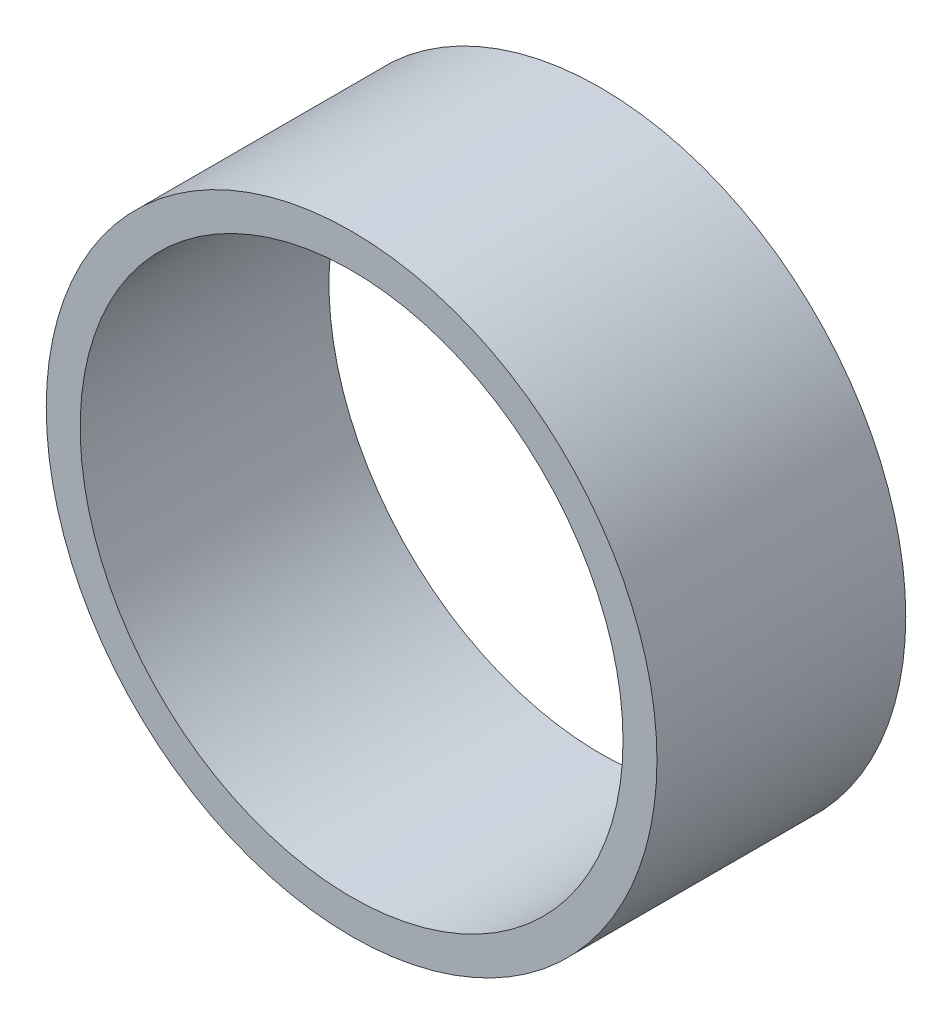
ISO-10303-21;
HEADER;
FILE_DESCRIPTION(('STEP AP214'),'2;1');
FILE_NAME('part.step','',(''),(''),'','','');
FILE_SCHEMA(('AUTOMOTIVE_DESIGN { 1 0 10303 214 1 1 1 1 }'));
ENDSEC;
DATA;
#1=APPLICATION_CONTEXT('core data for automotive mechanical design processes');
#2=APPLICATION_PROTOCOL_DEFINITION('international standard','automotive_design',2000,#1);
#3=PRODUCT_CONTEXT('',#1,'mechanical');
#4=PRODUCT('Part','Part','',(#3));
#5=PRODUCT_RELATED_PRODUCT_CATEGORY('part','',(#4));
#6=PRODUCT_DEFINITION_FORMATION('','',#4);
#7=PRODUCT_DEFINITION_CONTEXT('part definition',#1,'design');
#8=PRODUCT_DEFINITION('design','',#6,#7);
#9=PRODUCT_DEFINITION_SHAPE('','',#8);
#10=(LENGTH_UNIT() NAMED_UNIT(*) SI_UNIT(.MILLI.,.METRE.));
#11=(NAMED_UNIT(*) PLANE_ANGLE_UNIT() SI_UNIT($,.RADIAN.));
#12=(NAMED_UNIT(*) SI_UNIT($,.STERADIAN.) SOLID_ANGLE_UNIT());
#13=UNCERTAINTY_MEASURE_WITH_UNIT(LENGTH_MEASURE(1.E-05),#10,'distance_accuracy_value','');
#14=(GEOMETRIC_REPRESENTATION_CONTEXT(3) GLOBAL_UNCERTAINTY_ASSIGNED_CONTEXT((#13)) GLOBAL_UNIT_ASSIGNED_CONTEXT((#10,
#11,#12)) REPRESENTATION_CONTEXT('',''));
#15=CARTESIAN_POINT('',(0.,0.,0.));
#16=DIRECTION('',(0.,0.,1.));
#17=DIRECTION('',(1.,0.,0.));
#18=AXIS2_PLACEMENT_3D('',#15,#16,#17);
#19=CARTESIAN_POINT('',(0.,0.,27.5));
#20=DIRECTION('',(0.,0.,-1.));
#21=DIRECTION('',(-1.,0.,0.));
#22=AXIS2_PLACEMENT_3D('',#19,#20,#21);
#23=CYLINDRICAL_SURFACE('',#22,67.5);
#24=CARTESIAN_POINT('',(0.,0.,27.5));
#25=DIRECTION('',(0.,0.,1.));
#26=DIRECTION('',(1.,0.,0.));
#27=AXIS2_PLACEMENT_3D('',#24,#25,#26);
#28=CIRCLE('',#27,67.5);
#29=CARTESIAN_POINT('',(67.5,0.,27.5));
#30=VERTEX_POINT('',#29);
#31=EDGE_CURVE('E10',#30,#30,#28,.T.);
#32=ORIENTED_EDGE('',*,*,#31,.F.);
#33=EDGE_LOOP('',(#32));
#34=FACE_BOUND('',#33,.T.);
#35=CARTESIAN_POINT('',(0.,0.,-27.5));
#36=DIRECTION('',(0.,0.,1.));
#37=DIRECTION('',(1.,0.,0.));
#38=AXIS2_PLACEMENT_3D('',#35,#36,#37);
#39=CIRCLE('',#38,67.5);
#40=CARTESIAN_POINT('',(67.5,0.,-27.5));
#41=VERTEX_POINT('',#40);
#42=EDGE_CURVE('E40',#41,#41,#39,.T.);
#43=ORIENTED_EDGE('',*,*,#42,.T.);
#44=EDGE_LOOP('',(#43));
#45=FACE_BOUND('',#44,.T.);
#46=ADVANCED_FACE('F37',(#34,#45),#23,.T.);
#47=CARTESIAN_POINT('',(0.,0.,27.5));
#48=DIRECTION('',(0.,0.,1.));
#49=DIRECTION('',(1.,0.,0.));
#50=AXIS2_PLACEMENT_3D('',#47,#48,#49);
#51=PLANE('',#50);
#52=CARTESIAN_POINT('',(0.,0.,27.5));
#53=DIRECTION('',(0.,0.,1.));
#54=DIRECTION('',(1.,0.,0.));
#55=AXIS2_PLACEMENT_3D('',#52,#53,#54);
#56=CIRCLE('',#55,60.);
#57=CARTESIAN_POINT('',(60.,0.,27.5));
#58=VERTEX_POINT('',#57);
#59=EDGE_CURVE('E51',#58,#58,#56,.T.);
#60=ORIENTED_EDGE('',*,*,#59,.F.);
#61=EDGE_LOOP('',(#60));
#62=FACE_BOUND('',#61,.T.);
#63=ORIENTED_EDGE('',*,*,#31,.T.);
#64=EDGE_LOOP('',(#63));
#65=FACE_BOUND('',#64,.T.);
#66=ADVANCED_FACE('F68',(#62,#65),#51,.T.);
#67=CARTESIAN_POINT('',(0.,0.,-27.5));
#68=DIRECTION('',(0.,0.,1.));
#69=DIRECTION('',(1.,0.,0.));
#70=AXIS2_PLACEMENT_3D('',#67,#68,#69);
#71=PLANE('',#70);
#72=CARTESIAN_POINT('',(0.,0.,-27.5));
#73=DIRECTION('',(0.,0.,1.));
#74=DIRECTION('',(1.,0.,0.));
#75=AXIS2_PLACEMENT_3D('',#72,#73,#74);
#76=CIRCLE('',#75,60.);
#77=CARTESIAN_POINT('',(60.,0.,-27.5));
#78=VERTEX_POINT('',#77);
#79=EDGE_CURVE('E49',#78,#78,#76,.T.);
#80=ORIENTED_EDGE('',*,*,#79,.T.);
#81=EDGE_LOOP('',(#80));
#82=FACE_BOUND('',#81,.T.);
#83=ORIENTED_EDGE('',*,*,#42,.F.);
#84=EDGE_LOOP('',(#83));
#85=FACE_BOUND('',#84,.T.);
#86=ADVANCED_FACE('F59',(#82,#85),#71,.F.);
#87=CARTESIAN_POINT('',(0.,0.,-27.5));
#88=DIRECTION('',(0.,0.,1.));
#89=DIRECTION('',(1.,0.,0.));
#90=AXIS2_PLACEMENT_3D('',#87,#88,#89);
#91=CYLINDRICAL_SURFACE('',#90,60.);
#92=ORIENTED_EDGE('',*,*,#79,.F.);
#93=EDGE_LOOP('',(#92));
#94=FACE_BOUND('',#93,.T.);
#95=ORIENTED_EDGE('',*,*,#59,.T.);
#96=EDGE_LOOP('',(#95));
#97=FACE_BOUND('',#96,.T.);
#98=ADVANCED_FACE('F62',(#94,#97),#91,.F.);
#99=CLOSED_SHELL('',(#46,#66,#86,#98));
#100=MANIFOLD_SOLID_BREP('B2',#99);
#101=ADVANCED_BREP_SHAPE_REPRESENTATION('',(#18,#100),#14);
#102=SHAPE_DEFINITION_REPRESENTATION(#9,#101);
ENDSEC;
END-ISO-10303-21;
